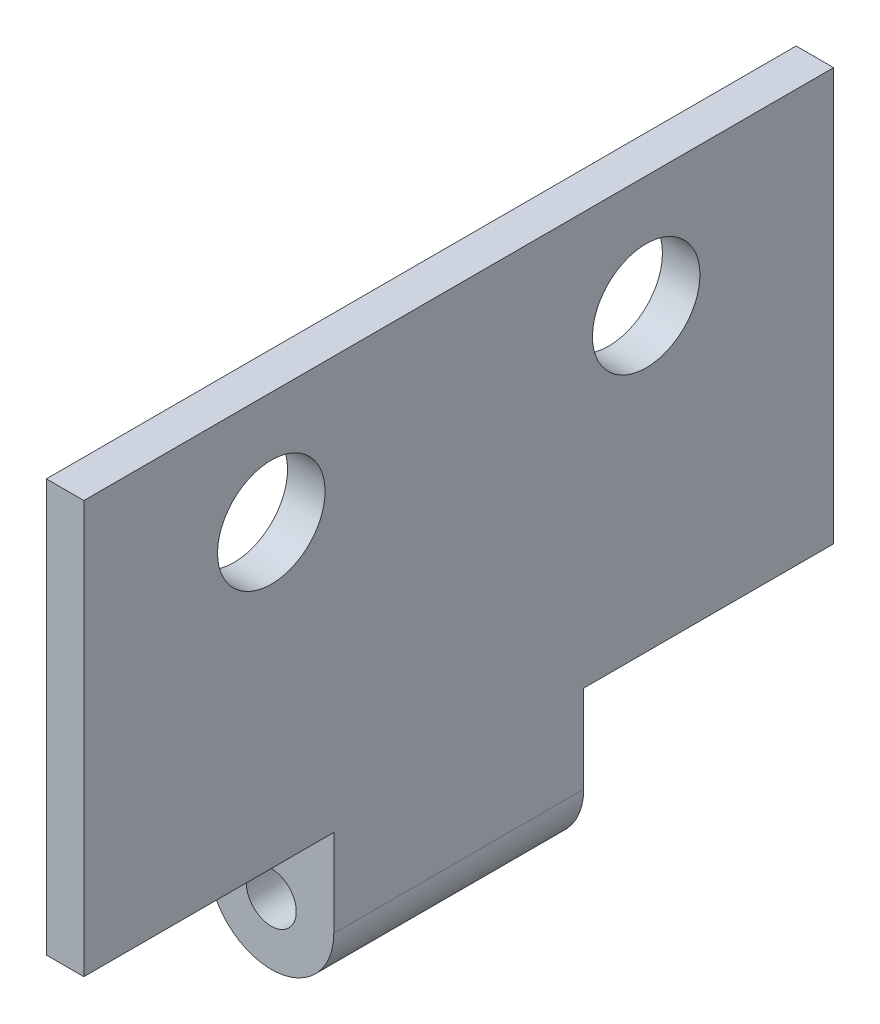
ISO-10303-21;
HEADER;
FILE_DESCRIPTION(('STEP AP214'),'2;1');
FILE_NAME('part.step','',(''),(''),'','','');
FILE_SCHEMA(('AUTOMOTIVE_DESIGN { 1 0 10303 214 1 1 1 1 }'));
ENDSEC;
DATA;
#1=APPLICATION_CONTEXT('core data for automotive mechanical design processes');
#2=APPLICATION_PROTOCOL_DEFINITION('international standard','automotive_design',2000,#1);
#3=PRODUCT_CONTEXT('',#1,'mechanical');
#4=PRODUCT('Part','Part','',(#3));
#5=PRODUCT_RELATED_PRODUCT_CATEGORY('part','',(#4));
#6=PRODUCT_DEFINITION_FORMATION('','',#4);
#7=PRODUCT_DEFINITION_CONTEXT('part definition',#1,'design');
#8=PRODUCT_DEFINITION('design','',#6,#7);
#9=PRODUCT_DEFINITION_SHAPE('','',#8);
#10=(LENGTH_UNIT() NAMED_UNIT(*) SI_UNIT(.MILLI.,.METRE.));
#11=(NAMED_UNIT(*) PLANE_ANGLE_UNIT() SI_UNIT($,.RADIAN.));
#12=(NAMED_UNIT(*) SI_UNIT($,.STERADIAN.) SOLID_ANGLE_UNIT());
#13=UNCERTAINTY_MEASURE_WITH_UNIT(LENGTH_MEASURE(1.E-05),#10,'distance_accuracy_value','');
#14=(GEOMETRIC_REPRESENTATION_CONTEXT(3) GLOBAL_UNCERTAINTY_ASSIGNED_CONTEXT((#13)) GLOBAL_UNIT_ASSIGNED_CONTEXT((#10,
#11,#12)) REPRESENTATION_CONTEXT('',''));
#15=CARTESIAN_POINT('',(0.,0.,0.));
#16=DIRECTION('',(0.,0.,1.));
#17=DIRECTION('',(1.,0.,0.));
#18=AXIS2_PLACEMENT_3D('',#15,#16,#17);
#19=CARTESIAN_POINT('',(0.,3.5,30.));
#20=DIRECTION('',(0.,0.,-1.));
#21=DIRECTION('',(-1.,0.,0.));
#22=AXIS2_PLACEMENT_3D('',#19,#20,#21);
#23=PLANE('',#22);
#24=DIRECTION('',(0.,-1.,0.));
#25=VECTOR('',#24,1.);
#26=CARTESIAN_POINT('',(0.999999999999999,3.5,30.));
#27=LINE('',#26,#25);
#28=CARTESIAN_POINT('',(1.,20.,30.));
#29=VERTEX_POINT('',#28);
#30=CARTESIAN_POINT('',(0.999999999999999,3.5,30.));
#31=VERTEX_POINT('',#30);
#32=EDGE_CURVE('E122',#29,#31,#27,.T.);
#33=ORIENTED_EDGE('',*,*,#32,.T.);
#34=DIRECTION('',(-1.,0.,0.));
#35=VECTOR('',#34,1.);
#36=CARTESIAN_POINT('',(2.5,3.5,30.));
#37=LINE('',#36,#35);
#38=CARTESIAN_POINT('',(2.5,3.5,30.));
#39=VERTEX_POINT('',#38);
#40=EDGE_CURVE('E63',#39,#31,#37,.T.);
#41=ORIENTED_EDGE('',*,*,#40,.F.);
#42=DIRECTION('',(0.,1.,0.));
#43=VECTOR('',#42,1.);
#44=CARTESIAN_POINT('',(2.5,0.,30.));
#45=LINE('',#44,#43);
#46=CARTESIAN_POINT('',(2.5,20.,30.));
#47=VERTEX_POINT('',#46);
#48=EDGE_CURVE('E84',#39,#47,#45,.T.);
#49=ORIENTED_EDGE('',*,*,#48,.T.);
#50=DIRECTION('',(-1.,0.,0.));
#51=VECTOR('',#50,1.);
#52=CARTESIAN_POINT('',(1.,20.,30.));
#53=LINE('',#52,#51);
#54=EDGE_CURVE('E129',#47,#29,#53,.T.);
#55=ORIENTED_EDGE('',*,*,#54,.T.);
#56=EDGE_LOOP('',(#33,#41,#49,#55));
#57=FACE_BOUND('',#56,.T.);
#58=ADVANCED_FACE('F37',(#57),#23,.F.);
#59=CARTESIAN_POINT('',(0.,3.5,0.));
#60=DIRECTION('',(0.,0.,-1.));
#61=DIRECTION('',(-1.,0.,0.));
#62=AXIS2_PLACEMENT_3D('',#59,#60,#61);
#63=PLANE('',#62);
#64=DIRECTION('',(-1.,0.,0.));
#65=VECTOR('',#64,1.);
#66=CARTESIAN_POINT('',(2.5,3.5,0.));
#67=LINE('',#66,#65);
#68=CARTESIAN_POINT('',(2.5,3.5,0.));
#69=VERTEX_POINT('',#68);
#70=CARTESIAN_POINT('',(0.999999999999999,3.5,0.));
#71=VERTEX_POINT('',#70);
#72=EDGE_CURVE('E181',#69,#71,#67,.T.);
#73=ORIENTED_EDGE('',*,*,#72,.T.);
#74=DIRECTION('',(0.,-1.,0.));
#75=VECTOR('',#74,1.);
#76=CARTESIAN_POINT('',(0.999999999999999,3.5,0.));
#77=LINE('',#76,#75);
#78=CARTESIAN_POINT('',(1.,20.,0.));
#79=VERTEX_POINT('',#78);
#80=EDGE_CURVE('E130',#79,#71,#77,.T.);
#81=ORIENTED_EDGE('',*,*,#80,.F.);
#82=DIRECTION('',(-1.,0.,0.));
#83=VECTOR('',#82,1.);
#84=CARTESIAN_POINT('',(1.,20.,0.));
#85=LINE('',#84,#83);
#86=CARTESIAN_POINT('',(2.5,20.,0.));
#87=VERTEX_POINT('',#86);
#88=EDGE_CURVE('E79',#87,#79,#85,.T.);
#89=ORIENTED_EDGE('',*,*,#88,.F.);
#90=DIRECTION('',(0.,1.,0.));
#91=VECTOR('',#90,1.);
#92=CARTESIAN_POINT('',(2.5,0.,0.));
#93=LINE('',#92,#91);
#94=EDGE_CURVE('E141',#69,#87,#93,.T.);
#95=ORIENTED_EDGE('',*,*,#94,.F.);
#96=EDGE_LOOP('',(#73,#81,#89,#95));
#97=FACE_BOUND('',#96,.T.);
#98=ADVANCED_FACE('F203',(#97),#63,.T.);
#99=CARTESIAN_POINT('',(0.,3.5,30.));
#100=DIRECTION('',(0.,0.,-1.));
#101=DIRECTION('',(-1.,0.,0.));
#102=AXIS2_PLACEMENT_3D('',#99,#100,#101);
#103=CYLINDRICAL_SURFACE('',#102,1.);
#104=DIRECTION('',(0.,0.,-1.));
#105=VECTOR('',#104,1.);
#106=CARTESIAN_POINT('',(0.999999999999999,3.5,30.));
#107=LINE('',#106,#105);
#108=CARTESIAN_POINT('',(0.999999999999999,3.5,20.));
#109=VERTEX_POINT('',#108);
#110=CARTESIAN_POINT('',(0.999999999999999,3.5,10.));
#111=VERTEX_POINT('',#110);
#112=EDGE_CURVE('E147',#109,#111,#107,.T.);
#113=ORIENTED_EDGE('',*,*,#112,.T.);
#114=CARTESIAN_POINT('',(0.,3.5,10.));
#115=DIRECTION('',(0.,0.,1.));
#116=DIRECTION('',(1.,0.,0.));
#117=AXIS2_PLACEMENT_3D('',#114,#115,#116);
#118=CIRCLE('',#117,1.);
#119=CARTESIAN_POINT('',(0.,2.5,10.));
#120=VERTEX_POINT('',#119);
#121=EDGE_CURVE('E136',#111,#120,#118,.F.);
#122=ORIENTED_EDGE('',*,*,#121,.T.);
#123=DIRECTION('',(0.,0.,-1.));
#124=VECTOR('',#123,1.);
#125=CARTESIAN_POINT('',(0.,2.5,30.));
#126=LINE('',#125,#124);
#127=CARTESIAN_POINT('',(0.,2.5,20.));
#128=VERTEX_POINT('',#127);
#129=EDGE_CURVE('E11',#128,#120,#126,.T.);
#130=ORIENTED_EDGE('',*,*,#129,.F.);
#131=CARTESIAN_POINT('',(0.,3.5,20.));
#132=DIRECTION('',(0.,0.,-1.));
#133=DIRECTION('',(-1.,0.,0.));
#134=AXIS2_PLACEMENT_3D('',#131,#132,#133);
#135=CIRCLE('',#134,1.);
#136=EDGE_CURVE('E159',#128,#109,#135,.F.);
#137=ORIENTED_EDGE('',*,*,#136,.T.);
#138=EDGE_LOOP('',(#113,#122,#130,#137));
#139=FACE_BOUND('',#138,.T.);
#140=ADVANCED_FACE('F39',(#139),#103,.F.);
#141=CARTESIAN_POINT('',(0.,0.,30.));
#142=DIRECTION('',(0.,0.,-1.));
#143=DIRECTION('',(-1.,0.,0.));
#144=AXIS2_PLACEMENT_3D('',#141,#142,#143);
#145=CYLINDRICAL_SURFACE('',#144,2.5);
#146=ORIENTED_EDGE('',*,*,#129,.T.);
#147=CARTESIAN_POINT('',(0.,0.,10.));
#148=DIRECTION('',(0.,0.,1.));
#149=DIRECTION('',(1.,0.,0.));
#150=AXIS2_PLACEMENT_3D('',#147,#148,#149);
#151=CIRCLE('',#150,2.5);
#152=CARTESIAN_POINT('',(2.5,0.,10.));
#153=VERTEX_POINT('',#152);
#154=EDGE_CURVE('E158',#120,#153,#151,.T.);
#155=ORIENTED_EDGE('',*,*,#154,.T.);
#156=DIRECTION('',(0.,0.,-1.));
#157=VECTOR('',#156,1.);
#158=CARTESIAN_POINT('',(2.5,0.,30.));
#159=LINE('',#158,#157);
#160=CARTESIAN_POINT('',(2.5,0.,20.));
#161=VERTEX_POINT('',#160);
#162=EDGE_CURVE('E46',#161,#153,#159,.T.);
#163=ORIENTED_EDGE('',*,*,#162,.F.);
#164=CARTESIAN_POINT('',(0.,0.,20.));
#165=DIRECTION('',(0.,0.,-1.));
#166=DIRECTION('',(-1.,0.,0.));
#167=AXIS2_PLACEMENT_3D('',#164,#165,#166);
#168=CIRCLE('',#167,2.5);
#169=EDGE_CURVE('E154',#161,#128,#168,.T.);
#170=ORIENTED_EDGE('',*,*,#169,.T.);
#171=EDGE_LOOP('',(#146,#155,#163,#170));
#172=FACE_BOUND('',#171,.T.);
#173=ADVANCED_FACE('F194',(#172),#145,.T.);
#174=CARTESIAN_POINT('',(2.5,0.,30.));
#175=DIRECTION('',(-1.,0.,0.));
#176=DIRECTION('',(0.,-1.,0.));
#177=AXIS2_PLACEMENT_3D('',#174,#175,#176);
#178=PLANE('',#177);
#179=CARTESIAN_POINT('',(2.5,15.5,22.5));
#180=DIRECTION('',(-1.,0.,0.));
#181=DIRECTION('',(0.,-1.,0.));
#182=AXIS2_PLACEMENT_3D('',#179,#180,#181);
#183=CIRCLE('',#182,2.15);
#184=CARTESIAN_POINT('',(2.5,13.35,22.5));
#185=VERTEX_POINT('',#184);
#186=EDGE_CURVE('E179',#185,#185,#183,.T.);
#187=ORIENTED_EDGE('',*,*,#186,.T.);
#188=EDGE_LOOP('',(#187));
#189=FACE_BOUND('',#188,.T.);
#190=CARTESIAN_POINT('',(2.5,15.5,7.5));
#191=DIRECTION('',(-1.,0.,0.));
#192=DIRECTION('',(0.,-1.,0.));
#193=AXIS2_PLACEMENT_3D('',#190,#191,#192);
#194=CIRCLE('',#193,2.15);
#195=CARTESIAN_POINT('',(2.5,13.35,7.5));
#196=VERTEX_POINT('',#195);
#197=EDGE_CURVE('E155',#196,#196,#194,.T.);
#198=ORIENTED_EDGE('',*,*,#197,.T.);
#199=EDGE_LOOP('',(#198));
#200=FACE_BOUND('',#199,.T.);
#201=ORIENTED_EDGE('',*,*,#162,.T.);
#202=DIRECTION('',(0.,1.,0.));
#203=VECTOR('',#202,1.);
#204=CARTESIAN_POINT('',(2.5,-3.5,10.));
#205=LINE('',#204,#203);
#206=CARTESIAN_POINT('',(2.5,3.5,10.));
#207=VERTEX_POINT('',#206);
#208=EDGE_CURVE('E187',#153,#207,#205,.T.);
#209=ORIENTED_EDGE('',*,*,#208,.T.);
#210=DIRECTION('',(0.,0.,-1.));
#211=VECTOR('',#210,1.);
#212=CARTESIAN_POINT('',(2.5,3.5,0.));
#213=LINE('',#212,#211);
#214=EDGE_CURVE('E182',#207,#69,#213,.T.);
#215=ORIENTED_EDGE('',*,*,#214,.T.);
#216=ORIENTED_EDGE('',*,*,#94,.T.);
#217=DIRECTION('',(0.,0.,-1.));
#218=VECTOR('',#217,1.);
#219=CARTESIAN_POINT('',(2.5,20.,30.));
#220=LINE('',#219,#218);
#221=EDGE_CURVE('E127',#47,#87,#220,.T.);
#222=ORIENTED_EDGE('',*,*,#221,.F.);
#223=ORIENTED_EDGE('',*,*,#48,.F.);
#224=DIRECTION('',(0.,0.,-1.));
#225=VECTOR('',#224,1.);
#226=CARTESIAN_POINT('',(2.5,3.5,30.));
#227=LINE('',#226,#225);
#228=CARTESIAN_POINT('',(2.5,3.5,20.));
#229=VERTEX_POINT('',#228);
#230=EDGE_CURVE('E112',#39,#229,#227,.T.);
#231=ORIENTED_EDGE('',*,*,#230,.T.);
#232=DIRECTION('',(0.,-1.,0.));
#233=VECTOR('',#232,1.);
#234=CARTESIAN_POINT('',(2.5,-3.5,20.));
#235=LINE('',#234,#233);
#236=EDGE_CURVE('E119',#229,#161,#235,.T.);
#237=ORIENTED_EDGE('',*,*,#236,.T.);
#238=EDGE_LOOP('',(#201,#209,#215,#216,#222,#223,#231,#237));
#239=FACE_BOUND('',#238,.T.);
#240=ADVANCED_FACE('F126',(#189,#200,#239),#178,.F.);
#241=CARTESIAN_POINT('',(1.,20.,30.));
#242=DIRECTION('',(0.,-1.,0.));
#243=DIRECTION('',(0.,0.,-1.));
#244=AXIS2_PLACEMENT_3D('',#241,#242,#243);
#245=PLANE('',#244);
#246=ORIENTED_EDGE('',*,*,#88,.T.);
#247=DIRECTION('',(0.,0.,-1.));
#248=VECTOR('',#247,1.);
#249=CARTESIAN_POINT('',(1.,20.,30.));
#250=LINE('',#249,#248);
#251=EDGE_CURVE('E146',#29,#79,#250,.T.);
#252=ORIENTED_EDGE('',*,*,#251,.F.);
#253=ORIENTED_EDGE('',*,*,#54,.F.);
#254=ORIENTED_EDGE('',*,*,#221,.T.);
#255=EDGE_LOOP('',(#246,#252,#253,#254));
#256=FACE_BOUND('',#255,.T.);
#257=ADVANCED_FACE('F204',(#256),#245,.F.);
#258=CARTESIAN_POINT('',(0.999999999999999,3.5,30.));
#259=DIRECTION('',(1.,0.,0.));
#260=DIRECTION('',(0.,1.,0.));
#261=AXIS2_PLACEMENT_3D('',#258,#259,#260);
#262=PLANE('',#261);
#263=CARTESIAN_POINT('',(1.,15.5,22.5));
#264=DIRECTION('',(1.,0.,0.));
#265=DIRECTION('',(0.,1.,0.));
#266=AXIS2_PLACEMENT_3D('',#263,#264,#265);
#267=CIRCLE('',#266,2.15);
#268=CARTESIAN_POINT('',(1.,17.65,22.5));
#269=VERTEX_POINT('',#268);
#270=EDGE_CURVE('E41',#269,#269,#267,.T.);
#271=ORIENTED_EDGE('',*,*,#270,.T.);
#272=EDGE_LOOP('',(#271));
#273=FACE_BOUND('',#272,.T.);
#274=CARTESIAN_POINT('',(1.,15.5,7.5));
#275=DIRECTION('',(1.,0.,0.));
#276=DIRECTION('',(0.,1.,0.));
#277=AXIS2_PLACEMENT_3D('',#274,#275,#276);
#278=CIRCLE('',#277,2.15);
#279=CARTESIAN_POINT('',(1.,17.65,7.5));
#280=VERTEX_POINT('',#279);
#281=EDGE_CURVE('E160',#280,#280,#278,.T.);
#282=ORIENTED_EDGE('',*,*,#281,.T.);
#283=EDGE_LOOP('',(#282));
#284=FACE_BOUND('',#283,.T.);
#285=ORIENTED_EDGE('',*,*,#80,.T.);
#286=EDGE_CURVE('E140',#111,#71,#107,.T.);
#287=ORIENTED_EDGE('',*,*,#286,.F.);
#288=ORIENTED_EDGE('',*,*,#112,.F.);
#289=EDGE_CURVE('E144',#31,#109,#107,.T.);
#290=ORIENTED_EDGE('',*,*,#289,.F.);
#291=ORIENTED_EDGE('',*,*,#32,.F.);
#292=ORIENTED_EDGE('',*,*,#251,.T.);
#293=EDGE_LOOP('',(#285,#287,#288,#290,#291,#292));
#294=FACE_BOUND('',#293,.T.);
#295=ADVANCED_FACE('F198',(#273,#284,#294),#262,.F.);
#296=CARTESIAN_POINT('',(2.5,3.5,30.));
#297=DIRECTION('',(0.,1.,0.));
#298=DIRECTION('',(-1.,0.,0.));
#299=AXIS2_PLACEMENT_3D('',#296,#297,#298);
#300=PLANE('',#299);
#301=DIRECTION('',(-1.,0.,0.));
#302=VECTOR('',#301,1.);
#303=CARTESIAN_POINT('',(2.5,3.5,20.));
#304=LINE('',#303,#302);
#305=EDGE_CURVE('E115',#229,#109,#304,.T.);
#306=ORIENTED_EDGE('',*,*,#305,.F.);
#307=ORIENTED_EDGE('',*,*,#230,.F.);
#308=ORIENTED_EDGE('',*,*,#40,.T.);
#309=ORIENTED_EDGE('',*,*,#289,.T.);
#310=EDGE_LOOP('',(#306,#307,#308,#309));
#311=FACE_BOUND('',#310,.T.);
#312=ADVANCED_FACE('F113',(#311),#300,.F.);
#313=CARTESIAN_POINT('',(2.5,-3.5,20.));
#314=DIRECTION('',(0.,0.,-1.));
#315=DIRECTION('',(-1.,0.,0.));
#316=AXIS2_PLACEMENT_3D('',#313,#314,#315);
#317=PLANE('',#316);
#318=CARTESIAN_POINT('',(0.,0.,20.));
#319=DIRECTION('',(0.,0.,-1.));
#320=DIRECTION('',(-1.,0.,0.));
#321=AXIS2_PLACEMENT_3D('',#318,#319,#320);
#322=CIRCLE('',#321,0.999999999999999);
#323=CARTESIAN_POINT('',(-0.999999999999999,0.,20.));
#324=VERTEX_POINT('',#323);
#325=EDGE_CURVE('E151',#324,#324,#322,.T.);
#326=ORIENTED_EDGE('',*,*,#325,.T.);
#327=EDGE_LOOP('',(#326));
#328=FACE_BOUND('',#327,.T.);
#329=ORIENTED_EDGE('',*,*,#169,.F.);
#330=ORIENTED_EDGE('',*,*,#236,.F.);
#331=ORIENTED_EDGE('',*,*,#305,.T.);
#332=ORIENTED_EDGE('',*,*,#136,.F.);
#333=EDGE_LOOP('',(#329,#330,#331,#332));
#334=FACE_BOUND('',#333,.T.);
#335=ADVANCED_FACE('F237',(#328,#334),#317,.F.);
#336=CARTESIAN_POINT('',(2.5,3.5,0.));
#337=DIRECTION('',(0.,1.,0.));
#338=DIRECTION('',(-1.,0.,0.));
#339=AXIS2_PLACEMENT_3D('',#336,#337,#338);
#340=PLANE('',#339);
#341=ORIENTED_EDGE('',*,*,#72,.F.);
#342=ORIENTED_EDGE('',*,*,#214,.F.);
#343=DIRECTION('',(-1.,0.,0.));
#344=VECTOR('',#343,1.);
#345=CARTESIAN_POINT('',(2.5,3.5,10.));
#346=LINE('',#345,#344);
#347=EDGE_CURVE('E54',#207,#111,#346,.T.);
#348=ORIENTED_EDGE('',*,*,#347,.T.);
#349=ORIENTED_EDGE('',*,*,#286,.T.);
#350=EDGE_LOOP('',(#341,#342,#348,#349));
#351=FACE_BOUND('',#350,.T.);
#352=ADVANCED_FACE('F199',(#351),#340,.F.);
#353=CARTESIAN_POINT('',(2.5,-3.5,10.));
#354=DIRECTION('',(0.,0.,1.));
#355=DIRECTION('',(1.,0.,0.));
#356=AXIS2_PLACEMENT_3D('',#353,#354,#355);
#357=PLANE('',#356);
#358=CARTESIAN_POINT('',(0.,0.,10.));
#359=DIRECTION('',(0.,0.,1.));
#360=DIRECTION('',(1.,0.,0.));
#361=AXIS2_PLACEMENT_3D('',#358,#359,#360);
#362=CIRCLE('',#361,0.999999999999999);
#363=CARTESIAN_POINT('',(0.999999999999999,0.,10.));
#364=VERTEX_POINT('',#363);
#365=EDGE_CURVE('E156',#364,#364,#362,.T.);
#366=ORIENTED_EDGE('',*,*,#365,.T.);
#367=EDGE_LOOP('',(#366));
#368=FACE_BOUND('',#367,.T.);
#369=ORIENTED_EDGE('',*,*,#347,.F.);
#370=ORIENTED_EDGE('',*,*,#208,.F.);
#371=ORIENTED_EDGE('',*,*,#154,.F.);
#372=ORIENTED_EDGE('',*,*,#121,.F.);
#373=EDGE_LOOP('',(#369,#370,#371,#372));
#374=FACE_BOUND('',#373,.T.);
#375=ADVANCED_FACE('F230',(#368,#374),#357,.F.);
#376=CARTESIAN_POINT('',(2.5,15.5,7.5));
#377=DIRECTION('',(-1.,0.,0.));
#378=DIRECTION('',(0.,-1.,0.));
#379=AXIS2_PLACEMENT_3D('',#376,#377,#378);
#380=CYLINDRICAL_SURFACE('',#379,2.15);
#381=ORIENTED_EDGE('',*,*,#197,.F.);
#382=EDGE_LOOP('',(#381));
#383=FACE_BOUND('',#382,.T.);
#384=ORIENTED_EDGE('',*,*,#281,.F.);
#385=EDGE_LOOP('',(#384));
#386=FACE_BOUND('',#385,.T.);
#387=ADVANCED_FACE('F227',(#383,#386),#380,.F.);
#388=CARTESIAN_POINT('',(2.5,15.5,22.5));
#389=DIRECTION('',(-1.,0.,0.));
#390=DIRECTION('',(0.,-1.,0.));
#391=AXIS2_PLACEMENT_3D('',#388,#389,#390);
#392=CYLINDRICAL_SURFACE('',#391,2.15);
#393=ORIENTED_EDGE('',*,*,#186,.F.);
#394=EDGE_LOOP('',(#393));
#395=FACE_BOUND('',#394,.T.);
#396=ORIENTED_EDGE('',*,*,#270,.F.);
#397=EDGE_LOOP('',(#396));
#398=FACE_BOUND('',#397,.T.);
#399=ADVANCED_FACE('F225',(#395,#398),#392,.F.);
#400=CARTESIAN_POINT('',(0.,0.,30.));
#401=DIRECTION('',(0.,0.,-1.));
#402=DIRECTION('',(-1.,0.,0.));
#403=AXIS2_PLACEMENT_3D('',#400,#401,#402);
#404=CYLINDRICAL_SURFACE('',#403,0.999999999999999);
#405=ORIENTED_EDGE('',*,*,#365,.F.);
#406=EDGE_LOOP('',(#405));
#407=FACE_BOUND('',#406,.T.);
#408=ORIENTED_EDGE('',*,*,#325,.F.);
#409=EDGE_LOOP('',(#408));
#410=FACE_BOUND('',#409,.T.);
#411=ADVANCED_FACE('F222',(#407,#410),#404,.F.);
#412=CLOSED_SHELL('',(#58,#98,#140,#173,#240,#257,#295,#312,#335,#352,#375,#387,#399,#411));
#413=MANIFOLD_SOLID_BREP('B2',#412);
#414=ADVANCED_BREP_SHAPE_REPRESENTATION('',(#18,#413),#14);
#415=SHAPE_DEFINITION_REPRESENTATION(#9,#414);
ENDSEC;
END-ISO-10303-21;
